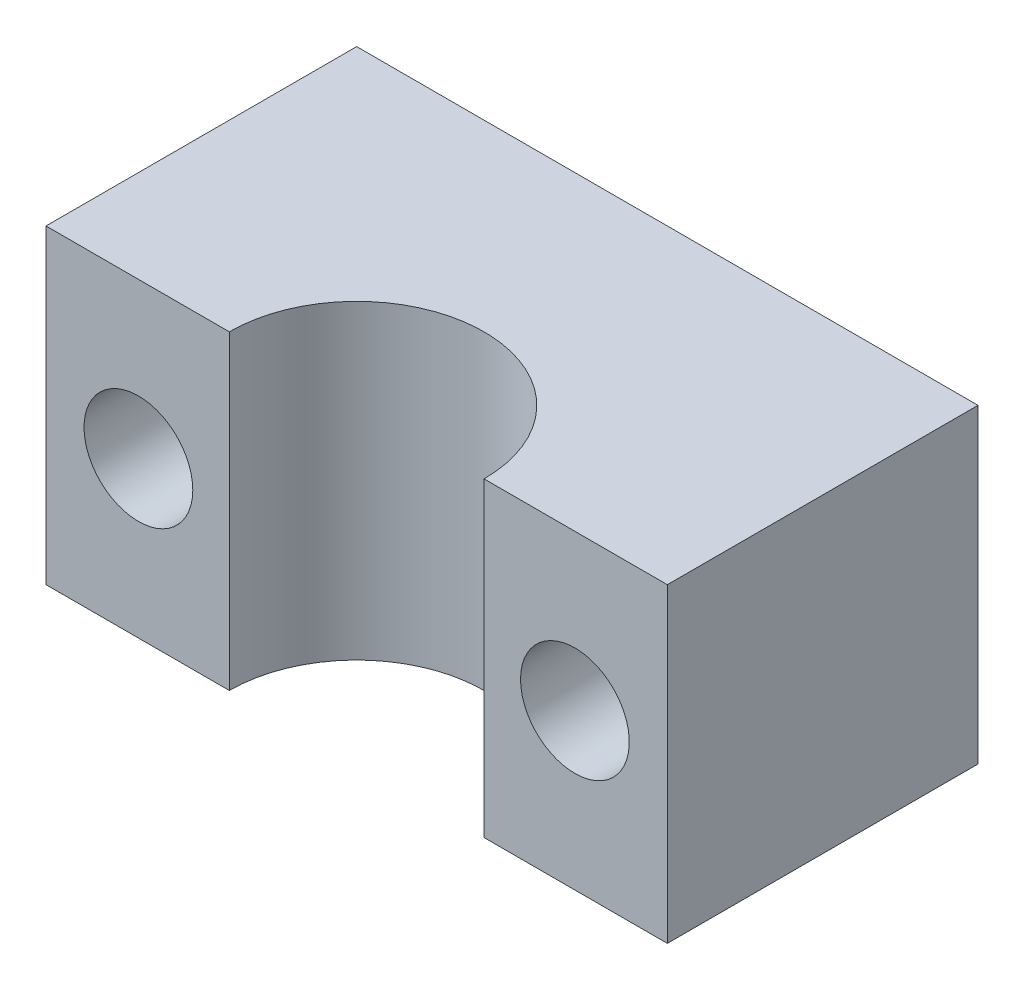
ISO-10303-21;
HEADER;
FILE_DESCRIPTION(('STEP AP214'),'2;1');
FILE_NAME('part.step','',(''),(''),'','','');
FILE_SCHEMA(('AUTOMOTIVE_DESIGN { 1 0 10303 214 1 1 1 1 }'));
ENDSEC;
DATA;
#1=APPLICATION_CONTEXT('core data for automotive mechanical design processes');
#2=APPLICATION_PROTOCOL_DEFINITION('international standard','automotive_design',2000,#1);
#3=PRODUCT_CONTEXT('',#1,'mechanical');
#4=PRODUCT('Part','Part','',(#3));
#5=PRODUCT_RELATED_PRODUCT_CATEGORY('part','',(#4));
#6=PRODUCT_DEFINITION_FORMATION('','',#4);
#7=PRODUCT_DEFINITION_CONTEXT('part definition',#1,'design');
#8=PRODUCT_DEFINITION('design','',#6,#7);
#9=PRODUCT_DEFINITION_SHAPE('','',#8);
#10=(LENGTH_UNIT() NAMED_UNIT(*) SI_UNIT(.MILLI.,.METRE.));
#11=(NAMED_UNIT(*) PLANE_ANGLE_UNIT() SI_UNIT($,.RADIAN.));
#12=(NAMED_UNIT(*) SI_UNIT($,.STERADIAN.) SOLID_ANGLE_UNIT());
#13=UNCERTAINTY_MEASURE_WITH_UNIT(LENGTH_MEASURE(1.E-05),#10,'distance_accuracy_value','');
#14=(GEOMETRIC_REPRESENTATION_CONTEXT(3) GLOBAL_UNCERTAINTY_ASSIGNED_CONTEXT((#13)) GLOBAL_UNIT_ASSIGNED_CONTEXT((#10,
#11,#12)) REPRESENTATION_CONTEXT('',''));
#15=CARTESIAN_POINT('',(0.,0.,0.));
#16=DIRECTION('',(0.,0.,1.));
#17=DIRECTION('',(1.,0.,0.));
#18=AXIS2_PLACEMENT_3D('',#15,#16,#17);
#19=CARTESIAN_POINT('',(0.,0.,10.));
#20=DIRECTION('',(0.,0.,-1.));
#21=DIRECTION('',(-1.,0.,0.));
#22=AXIS2_PLACEMENT_3D('',#19,#20,#21);
#23=PLANE('',#22);
#24=DIRECTION('',(0.,-1.,0.));
#25=VECTOR('',#24,1.);
#26=CARTESIAN_POINT('',(-12.4583333333333,-2.57499999999999,10.));
#27=LINE('',#26,#25);
#28=CARTESIAN_POINT('',(-12.4583333333333,7.42500000000001,10.));
#29=VERTEX_POINT('',#28);
#30=CARTESIAN_POINT('',(-12.4583333333333,-2.57499999999999,10.));
#31=VERTEX_POINT('',#30);
#32=EDGE_CURVE('E133',#29,#31,#27,.T.);
#33=ORIENTED_EDGE('',*,*,#32,.T.);
#34=DIRECTION('',(1.,0.,0.));
#35=VECTOR('',#34,1.);
#36=CARTESIAN_POINT('',(-12.4583333333333,-2.57499999999999,10.));
#37=LINE('',#36,#35);
#38=CARTESIAN_POINT('',(-6.55833333333334,-2.57499999999999,10.));
#39=VERTEX_POINT('',#38);
#40=EDGE_CURVE('E135',#31,#39,#37,.T.);
#41=ORIENTED_EDGE('',*,*,#40,.T.);
#42=DIRECTION('',(0.,1.,0.));
#43=VECTOR('',#42,1.);
#44=CARTESIAN_POINT('',(-6.55833333333334,-2.57499999999999,10.));
#45=LINE('',#44,#43);
#46=CARTESIAN_POINT('',(-6.55833333333334,7.42500000000001,10.));
#47=VERTEX_POINT('',#46);
#48=EDGE_CURVE('E79',#39,#47,#45,.T.);
#49=ORIENTED_EDGE('',*,*,#48,.T.);
#50=DIRECTION('',(-1.,0.,0.));
#51=VECTOR('',#50,1.);
#52=CARTESIAN_POINT('',(-12.4583333333333,7.42500000000001,10.));
#53=LINE('',#52,#51);
#54=EDGE_CURVE('E50',#47,#29,#53,.T.);
#55=ORIENTED_EDGE('',*,*,#54,.T.);
#56=EDGE_LOOP('',(#33,#41,#49,#55));
#57=FACE_BOUND('',#56,.T.);
#58=CARTESIAN_POINT('',(-9.48333333333334,2.42500000000001,10.));
#59=DIRECTION('',(0.,0.,1.));
#60=DIRECTION('',(1.,0.,0.));
#61=AXIS2_PLACEMENT_3D('',#58,#59,#60);
#62=CIRCLE('',#61,1.75);
#63=CARTESIAN_POINT('',(-7.73333333333334,2.42500000000001,10.));
#64=VERTEX_POINT('',#63);
#65=EDGE_CURVE('E127',#64,#64,#62,.T.);
#66=ORIENTED_EDGE('',*,*,#65,.F.);
#67=EDGE_LOOP('',(#66));
#68=FACE_BOUND('',#67,.T.);
#69=ADVANCED_FACE('F33',(#57,#68),#23,.F.);
#70=CARTESIAN_POINT('',(0.,0.,0.));
#71=DIRECTION('',(0.,0.,-1.));
#72=DIRECTION('',(-1.,0.,0.));
#73=AXIS2_PLACEMENT_3D('',#70,#71,#72);
#74=PLANE('',#73);
#75=DIRECTION('',(0.,-1.,0.));
#76=VECTOR('',#75,1.);
#77=CARTESIAN_POINT('',(-12.4583333333333,-2.57499999999999,0.));
#78=LINE('',#77,#76);
#79=CARTESIAN_POINT('',(-12.4583333333333,7.42500000000001,0.));
#80=VERTEX_POINT('',#79);
#81=CARTESIAN_POINT('',(-12.4583333333333,-2.57499999999999,0.));
#82=VERTEX_POINT('',#81);
#83=EDGE_CURVE('E130',#80,#82,#78,.T.);
#84=ORIENTED_EDGE('',*,*,#83,.F.);
#85=DIRECTION('',(-1.,0.,0.));
#86=VECTOR('',#85,1.);
#87=CARTESIAN_POINT('',(-12.4583333333333,7.42500000000001,0.));
#88=LINE('',#87,#86);
#89=CARTESIAN_POINT('',(7.54166666666666,7.42500000000001,0.));
#90=VERTEX_POINT('',#89);
#91=EDGE_CURVE('E93',#90,#80,#88,.T.);
#92=ORIENTED_EDGE('',*,*,#91,.F.);
#93=DIRECTION('',(0.,1.,0.));
#94=VECTOR('',#93,1.);
#95=CARTESIAN_POINT('',(7.54166666666666,-2.57499999999999,0.));
#96=LINE('',#95,#94);
#97=CARTESIAN_POINT('',(7.54166666666666,-2.57499999999999,0.));
#98=VERTEX_POINT('',#97);
#99=EDGE_CURVE('E115',#98,#90,#96,.T.);
#100=ORIENTED_EDGE('',*,*,#99,.F.);
#101=DIRECTION('',(1.,0.,0.));
#102=VECTOR('',#101,1.);
#103=CARTESIAN_POINT('',(-12.4583333333333,-2.57499999999999,0.));
#104=LINE('',#103,#102);
#105=EDGE_CURVE('E62',#82,#98,#104,.T.);
#106=ORIENTED_EDGE('',*,*,#105,.F.);
#107=EDGE_LOOP('',(#84,#92,#100,#106));
#108=FACE_BOUND('',#107,.T.);
#109=CARTESIAN_POINT('',(-9.48333333333334,2.42500000000001,0.));
#110=DIRECTION('',(0.,0.,1.));
#111=DIRECTION('',(1.,0.,0.));
#112=AXIS2_PLACEMENT_3D('',#109,#110,#111);
#113=CIRCLE('',#112,1.75);
#114=CARTESIAN_POINT('',(-7.73333333333334,2.42500000000001,0.));
#115=VERTEX_POINT('',#114);
#116=EDGE_CURVE('E126',#115,#115,#113,.T.);
#117=ORIENTED_EDGE('',*,*,#116,.T.);
#118=EDGE_LOOP('',(#117));
#119=FACE_BOUND('',#118,.T.);
#120=CARTESIAN_POINT('',(4.56666666666665,2.42500000000001,0.));
#121=DIRECTION('',(0.,0.,1.));
#122=DIRECTION('',(-1.,0.,0.));
#123=AXIS2_PLACEMENT_3D('',#120,#121,#122);
#124=CIRCLE('',#123,1.75);
#125=CARTESIAN_POINT('',(2.81666666666665,2.42500000000001,0.));
#126=VERTEX_POINT('',#125);
#127=EDGE_CURVE('E155',#126,#126,#124,.T.);
#128=ORIENTED_EDGE('',*,*,#127,.T.);
#129=EDGE_LOOP('',(#128));
#130=FACE_BOUND('',#129,.T.);
#131=ADVANCED_FACE('F147',(#108,#119,#130),#74,.T.);
#132=CARTESIAN_POINT('',(-12.4583333333333,-2.57499999999999,10.));
#133=DIRECTION('',(1.,0.,0.));
#134=DIRECTION('',(0.,0.,-1.));
#135=AXIS2_PLACEMENT_3D('',#132,#133,#134);
#136=PLANE('',#135);
#137=ORIENTED_EDGE('',*,*,#83,.T.);
#138=DIRECTION('',(0.,0.,-1.));
#139=VECTOR('',#138,1.);
#140=CARTESIAN_POINT('',(-12.4583333333333,-2.57499999999999,10.));
#141=LINE('',#140,#139);
#142=EDGE_CURVE('E11',#31,#82,#141,.T.);
#143=ORIENTED_EDGE('',*,*,#142,.F.);
#144=ORIENTED_EDGE('',*,*,#32,.F.);
#145=DIRECTION('',(0.,0.,-1.));
#146=VECTOR('',#145,1.);
#147=CARTESIAN_POINT('',(-12.4583333333333,7.42500000000001,10.));
#148=LINE('',#147,#146);
#149=EDGE_CURVE('E42',#29,#80,#148,.T.);
#150=ORIENTED_EDGE('',*,*,#149,.T.);
#151=EDGE_LOOP('',(#137,#143,#144,#150));
#152=FACE_BOUND('',#151,.T.);
#153=ADVANCED_FACE('F35',(#152),#136,.F.);
#154=CARTESIAN_POINT('',(-12.4583333333333,-2.57499999999999,10.));
#155=DIRECTION('',(0.,1.,0.));
#156=DIRECTION('',(0.,0.,1.));
#157=AXIS2_PLACEMENT_3D('',#154,#155,#156);
#158=PLANE('',#157);
#159=ORIENTED_EDGE('',*,*,#105,.T.);
#160=DIRECTION('',(0.,0.,-1.));
#161=VECTOR('',#160,1.);
#162=CARTESIAN_POINT('',(7.54166666666666,-2.57499999999999,10.));
#163=LINE('',#162,#161);
#164=CARTESIAN_POINT('',(7.54166666666666,-2.57499999999999,10.));
#165=VERTEX_POINT('',#164);
#166=EDGE_CURVE('E102',#165,#98,#163,.T.);
#167=ORIENTED_EDGE('',*,*,#166,.F.);
#168=DIRECTION('',(1.,0.,0.));
#169=VECTOR('',#168,1.);
#170=CARTESIAN_POINT('',(7.54166666666666,-2.57499999999999,10.));
#171=LINE('',#170,#169);
#172=CARTESIAN_POINT('',(1.64166666666666,-2.57499999999999,10.));
#173=VERTEX_POINT('',#172);
#174=EDGE_CURVE('E108',#173,#165,#171,.T.);
#175=ORIENTED_EDGE('',*,*,#174,.F.);
#176=CARTESIAN_POINT('',(-2.45833333333334,-2.57499999999999,10.));
#177=DIRECTION('',(0.,1.,0.));
#178=DIRECTION('',(0.,0.,-1.));
#179=AXIS2_PLACEMENT_3D('',#176,#177,#178);
#180=CIRCLE('',#179,4.1);
#181=EDGE_CURVE('E118',#173,#39,#180,.T.);
#182=ORIENTED_EDGE('',*,*,#181,.T.);
#183=ORIENTED_EDGE('',*,*,#40,.F.);
#184=ORIENTED_EDGE('',*,*,#142,.T.);
#185=EDGE_LOOP('',(#159,#167,#175,#182,#183,#184));
#186=FACE_BOUND('',#185,.T.);
#187=ADVANCED_FACE('F117',(#186),#158,.F.);
#188=CARTESIAN_POINT('',(-12.4583333333333,7.42500000000001,10.));
#189=DIRECTION('',(0.,-1.,0.));
#190=DIRECTION('',(0.,0.,-1.));
#191=AXIS2_PLACEMENT_3D('',#188,#189,#190);
#192=PLANE('',#191);
#193=ORIENTED_EDGE('',*,*,#91,.T.);
#194=ORIENTED_EDGE('',*,*,#149,.F.);
#195=ORIENTED_EDGE('',*,*,#54,.F.);
#196=CARTESIAN_POINT('',(-2.45833333333334,7.42500000000001,10.));
#197=DIRECTION('',(0.,1.,0.));
#198=DIRECTION('',(0.,0.,-1.));
#199=AXIS2_PLACEMENT_3D('',#196,#197,#198);
#200=CIRCLE('',#199,4.1);
#201=CARTESIAN_POINT('',(1.64166666666666,7.42500000000001,10.));
#202=VERTEX_POINT('',#201);
#203=EDGE_CURVE('E71',#202,#47,#200,.T.);
#204=ORIENTED_EDGE('',*,*,#203,.F.);
#205=DIRECTION('',(-1.,0.,0.));
#206=VECTOR('',#205,1.);
#207=CARTESIAN_POINT('',(7.54166666666666,7.42500000000001,10.));
#208=LINE('',#207,#206);
#209=CARTESIAN_POINT('',(7.54166666666666,7.42500000000001,10.));
#210=VERTEX_POINT('',#209);
#211=EDGE_CURVE('E107',#210,#202,#208,.T.);
#212=ORIENTED_EDGE('',*,*,#211,.F.);
#213=DIRECTION('',(0.,0.,-1.));
#214=VECTOR('',#213,1.);
#215=CARTESIAN_POINT('',(7.54166666666666,7.42500000000001,10.));
#216=LINE('',#215,#214);
#217=EDGE_CURVE('E104',#210,#90,#216,.T.);
#218=ORIENTED_EDGE('',*,*,#217,.T.);
#219=EDGE_LOOP('',(#193,#194,#195,#204,#212,#218));
#220=FACE_BOUND('',#219,.T.);
#221=ADVANCED_FACE('F162',(#220),#192,.F.);
#222=CARTESIAN_POINT('',(-9.48333333333334,2.42500000000001,10.));
#223=DIRECTION('',(0.,0.,-1.));
#224=DIRECTION('',(-1.,0.,0.));
#225=AXIS2_PLACEMENT_3D('',#222,#223,#224);
#226=CYLINDRICAL_SURFACE('',#225,1.75);
#227=ORIENTED_EDGE('',*,*,#65,.T.);
#228=EDGE_LOOP('',(#227));
#229=FACE_BOUND('',#228,.T.);
#230=ORIENTED_EDGE('',*,*,#116,.F.);
#231=EDGE_LOOP('',(#230));
#232=FACE_BOUND('',#231,.T.);
#233=ADVANCED_FACE('F164',(#229,#232),#226,.F.);
#234=CARTESIAN_POINT('',(-2.45833333333334,7.42500000000001,10.));
#235=DIRECTION('',(0.,-1.,0.));
#236=DIRECTION('',(0.,0.,-1.));
#237=AXIS2_PLACEMENT_3D('',#234,#235,#236);
#238=CYLINDRICAL_SURFACE('',#237,4.1);
#239=ORIENTED_EDGE('',*,*,#181,.F.);
#240=DIRECTION('',(0.,-1.,0.));
#241=VECTOR('',#240,1.);
#242=CARTESIAN_POINT('',(1.64166666666666,7.42500000000001,10.));
#243=LINE('',#242,#241);
#244=EDGE_CURVE('E114',#202,#173,#243,.T.);
#245=ORIENTED_EDGE('',*,*,#244,.F.);
#246=ORIENTED_EDGE('',*,*,#203,.T.);
#247=ORIENTED_EDGE('',*,*,#48,.F.);
#248=EDGE_LOOP('',(#239,#245,#246,#247));
#249=FACE_BOUND('',#248,.T.);
#250=ADVANCED_FACE('F170',(#249),#238,.F.);
#251=CARTESIAN_POINT('',(0.,0.,10.));
#252=DIRECTION('',(0.,0.,-1.));
#253=DIRECTION('',(-1.,0.,0.));
#254=AXIS2_PLACEMENT_3D('',#251,#252,#253);
#255=PLANE('',#254);
#256=ORIENTED_EDGE('',*,*,#174,.T.);
#257=DIRECTION('',(0.,1.,0.));
#258=VECTOR('',#257,1.);
#259=CARTESIAN_POINT('',(7.54166666666666,-2.57499999999999,10.));
#260=LINE('',#259,#258);
#261=EDGE_CURVE('E99',#165,#210,#260,.T.);
#262=ORIENTED_EDGE('',*,*,#261,.T.);
#263=ORIENTED_EDGE('',*,*,#211,.T.);
#264=ORIENTED_EDGE('',*,*,#244,.T.);
#265=EDGE_LOOP('',(#256,#262,#263,#264));
#266=FACE_BOUND('',#265,.T.);
#267=CARTESIAN_POINT('',(4.56666666666665,2.42500000000001,10.));
#268=DIRECTION('',(0.,0.,1.));
#269=DIRECTION('',(-1.,0.,0.));
#270=AXIS2_PLACEMENT_3D('',#267,#268,#269);
#271=CIRCLE('',#270,1.75);
#272=CARTESIAN_POINT('',(2.81666666666665,2.42500000000001,10.));
#273=VERTEX_POINT('',#272);
#274=EDGE_CURVE('E157',#273,#273,#271,.T.);
#275=ORIENTED_EDGE('',*,*,#274,.F.);
#276=EDGE_LOOP('',(#275));
#277=FACE_BOUND('',#276,.T.);
#278=ADVANCED_FACE('F112',(#266,#277),#255,.F.);
#279=CARTESIAN_POINT('',(7.54166666666666,-2.57499999999999,10.));
#280=DIRECTION('',(-1.,0.,0.));
#281=DIRECTION('',(0.,0.,1.));
#282=AXIS2_PLACEMENT_3D('',#279,#280,#281);
#283=PLANE('',#282);
#284=ORIENTED_EDGE('',*,*,#99,.T.);
#285=ORIENTED_EDGE('',*,*,#217,.F.);
#286=ORIENTED_EDGE('',*,*,#261,.F.);
#287=ORIENTED_EDGE('',*,*,#166,.T.);
#288=EDGE_LOOP('',(#284,#285,#286,#287));
#289=FACE_BOUND('',#288,.T.);
#290=ADVANCED_FACE('F101',(#289),#283,.F.);
#291=CARTESIAN_POINT('',(4.56666666666665,2.42500000000001,10.));
#292=DIRECTION('',(0.,0.,-1.));
#293=DIRECTION('',(-1.,0.,0.));
#294=AXIS2_PLACEMENT_3D('',#291,#292,#293);
#295=CYLINDRICAL_SURFACE('',#294,1.75);
#296=ORIENTED_EDGE('',*,*,#274,.T.);
#297=EDGE_LOOP('',(#296));
#298=FACE_BOUND('',#297,.T.);
#299=ORIENTED_EDGE('',*,*,#127,.F.);
#300=EDGE_LOOP('',(#299));
#301=FACE_BOUND('',#300,.T.);
#302=ADVANCED_FACE('F183',(#298,#301),#295,.F.);
#303=CLOSED_SHELL('',(#69,#131,#153,#187,#221,#233,#250,#278,#290,#302));
#304=MANIFOLD_SOLID_BREP('B2',#303);
#305=ADVANCED_BREP_SHAPE_REPRESENTATION('',(#18,#304),#14);
#306=SHAPE_DEFINITION_REPRESENTATION(#9,#305);
ENDSEC;
END-ISO-10303-21;
